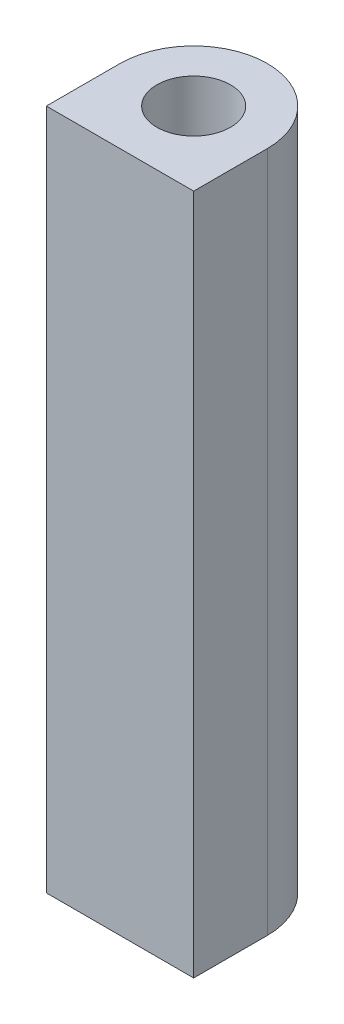
ISO-10303-21;
HEADER;
FILE_DESCRIPTION(('STEP AP214'),'2;1');
FILE_NAME('part.step','',(''),(''),'','','');
FILE_SCHEMA(('AUTOMOTIVE_DESIGN { 1 0 10303 214 1 1 1 1 }'));
ENDSEC;
DATA;
#1=APPLICATION_CONTEXT('core data for automotive mechanical design processes');
#2=APPLICATION_PROTOCOL_DEFINITION('international standard','automotive_design',2000,#1);
#3=PRODUCT_CONTEXT('',#1,'mechanical');
#4=PRODUCT('Part','Part','',(#3));
#5=PRODUCT_RELATED_PRODUCT_CATEGORY('part','',(#4));
#6=PRODUCT_DEFINITION_FORMATION('','',#4);
#7=PRODUCT_DEFINITION_CONTEXT('part definition',#1,'design');
#8=PRODUCT_DEFINITION('design','',#6,#7);
#9=PRODUCT_DEFINITION_SHAPE('','',#8);
#10=(LENGTH_UNIT() NAMED_UNIT(*) SI_UNIT(.MILLI.,.METRE.));
#11=(NAMED_UNIT(*) PLANE_ANGLE_UNIT() SI_UNIT($,.RADIAN.));
#12=(NAMED_UNIT(*) SI_UNIT($,.STERADIAN.) SOLID_ANGLE_UNIT());
#13=UNCERTAINTY_MEASURE_WITH_UNIT(LENGTH_MEASURE(1.E-05),#10,'distance_accuracy_value','');
#14=(GEOMETRIC_REPRESENTATION_CONTEXT(3) GLOBAL_UNCERTAINTY_ASSIGNED_CONTEXT((#13)) GLOBAL_UNIT_ASSIGNED_CONTEXT((#10,
#11,#12)) REPRESENTATION_CONTEXT('',''));
#15=CARTESIAN_POINT('',(0.,0.,0.));
#16=DIRECTION('',(0.,0.,1.));
#17=DIRECTION('',(1.,0.,0.));
#18=AXIS2_PLACEMENT_3D('',#15,#16,#17);
#19=CARTESIAN_POINT('',(0.,46.25,0.));
#20=DIRECTION('',(0.,-1.,0.));
#21=DIRECTION('',(0.,0.,-1.));
#22=AXIS2_PLACEMENT_3D('',#19,#20,#21);
#23=CYLINDRICAL_SURFACE('',#22,2.5);
#24=CARTESIAN_POINT('',(0.,46.25,0.));
#25=DIRECTION('',(0.,-1.,0.));
#26=DIRECTION('',(0.,0.,-1.));
#27=AXIS2_PLACEMENT_3D('',#24,#25,#26);
#28=CIRCLE('',#27,2.5);
#29=CARTESIAN_POINT('',(0.,46.25,-2.5));
#30=VERTEX_POINT('',#29);
#31=EDGE_CURVE('E100',#30,#30,#28,.T.);
#32=ORIENTED_EDGE('',*,*,#31,.F.);
#33=EDGE_LOOP('',(#32));
#34=FACE_BOUND('',#33,.T.);
#35=CARTESIAN_POINT('',(0.,0.,0.));
#36=DIRECTION('',(0.,-1.,0.));
#37=DIRECTION('',(0.,0.,-1.));
#38=AXIS2_PLACEMENT_3D('',#35,#36,#37);
#39=CIRCLE('',#38,2.5);
#40=CARTESIAN_POINT('',(0.,0.,-2.5));
#41=VERTEX_POINT('',#40);
#42=EDGE_CURVE('E20',#41,#41,#39,.T.);
#43=ORIENTED_EDGE('',*,*,#42,.T.);
#44=EDGE_LOOP('',(#43));
#45=FACE_BOUND('',#44,.T.);
#46=ADVANCED_FACE('F17',(#34,#45),#23,.F.);
#47=CARTESIAN_POINT('',(0.,46.25,0.));
#48=DIRECTION('',(0.,-1.,0.));
#49=DIRECTION('',(0.,0.,-1.));
#50=AXIS2_PLACEMENT_3D('',#47,#48,#49);
#51=CYLINDRICAL_SURFACE('',#50,5.);
#52=CARTESIAN_POINT('',(0.,0.,0.));
#53=DIRECTION('',(0.,-1.,0.));
#54=DIRECTION('',(0.,0.,-1.));
#55=AXIS2_PLACEMENT_3D('',#52,#53,#54);
#56=CIRCLE('',#55,5.);
#57=CARTESIAN_POINT('',(5.,0.,0.));
#58=VERTEX_POINT('',#57);
#59=CARTESIAN_POINT('',(-5.,0.,0.));
#60=VERTEX_POINT('',#59);
#61=EDGE_CURVE('E57',#58,#60,#56,.F.);
#62=ORIENTED_EDGE('',*,*,#61,.T.);
#63=DIRECTION('',(0.,1.,0.));
#64=VECTOR('',#63,1.);
#65=CARTESIAN_POINT('',(-5.,0.,0.));
#66=LINE('',#65,#64);
#67=CARTESIAN_POINT('',(-5.,46.25,0.));
#68=VERTEX_POINT('',#67);
#69=EDGE_CURVE('E52',#60,#68,#66,.T.);
#70=ORIENTED_EDGE('',*,*,#69,.T.);
#71=CARTESIAN_POINT('',(0.,46.25,0.));
#72=DIRECTION('',(0.,-1.,0.));
#73=DIRECTION('',(0.,0.,-1.));
#74=AXIS2_PLACEMENT_3D('',#71,#72,#73);
#75=CIRCLE('',#74,5.);
#76=CARTESIAN_POINT('',(5.,46.25,0.));
#77=VERTEX_POINT('',#76);
#78=EDGE_CURVE('E70',#77,#68,#75,.F.);
#79=ORIENTED_EDGE('',*,*,#78,.F.);
#80=DIRECTION('',(0.,1.,0.));
#81=VECTOR('',#80,1.);
#82=CARTESIAN_POINT('',(5.,0.,0.));
#83=LINE('',#82,#81);
#84=EDGE_CURVE('E68',#77,#58,#83,.F.);
#85=ORIENTED_EDGE('',*,*,#84,.T.);
#86=EDGE_LOOP('',(#62,#70,#79,#85));
#87=FACE_BOUND('',#86,.T.);
#88=ADVANCED_FACE('F69',(#87),#51,.T.);
#89=CARTESIAN_POINT('',(5.,0.,0.));
#90=DIRECTION('',(-1.,0.,0.));
#91=DIRECTION('',(0.,0.,1.));
#92=AXIS2_PLACEMENT_3D('',#89,#90,#91);
#93=PLANE('',#92);
#94=DIRECTION('',(0.,1.,0.));
#95=VECTOR('',#94,1.);
#96=CARTESIAN_POINT('',(5.,0.,5.));
#97=LINE('',#96,#95);
#98=CARTESIAN_POINT('',(5.,46.25,5.));
#99=VERTEX_POINT('',#98);
#100=CARTESIAN_POINT('',(5.,0.,5.));
#101=VERTEX_POINT('',#100);
#102=EDGE_CURVE('E78',#99,#101,#97,.F.);
#103=ORIENTED_EDGE('',*,*,#102,.T.);
#104=DIRECTION('',(0.,0.,1.));
#105=VECTOR('',#104,1.);
#106=CARTESIAN_POINT('',(5.,0.,0.));
#107=LINE('',#106,#105);
#108=EDGE_CURVE('E63',#101,#58,#107,.F.);
#109=ORIENTED_EDGE('',*,*,#108,.T.);
#110=ORIENTED_EDGE('',*,*,#84,.F.);
#111=DIRECTION('',(0.,0.,1.));
#112=VECTOR('',#111,1.);
#113=CARTESIAN_POINT('',(5.,46.25,0.));
#114=LINE('',#113,#112);
#115=EDGE_CURVE('E89',#99,#77,#114,.F.);
#116=ORIENTED_EDGE('',*,*,#115,.F.);
#117=EDGE_LOOP('',(#103,#109,#110,#116));
#118=FACE_BOUND('',#117,.T.);
#119=ADVANCED_FACE('F76',(#118),#93,.F.);
#120=CARTESIAN_POINT('',(0.,0.,0.));
#121=DIRECTION('',(0.,1.,0.));
#122=DIRECTION('',(0.,0.,1.));
#123=AXIS2_PLACEMENT_3D('',#120,#121,#122);
#124=PLANE('',#123);
#125=ORIENTED_EDGE('',*,*,#61,.F.);
#126=ORIENTED_EDGE('',*,*,#108,.F.);
#127=DIRECTION('',(-1.,0.,0.));
#128=VECTOR('',#127,1.);
#129=CARTESIAN_POINT('',(0.,0.,5.));
#130=LINE('',#129,#128);
#131=CARTESIAN_POINT('',(-5.,0.,5.));
#132=VERTEX_POINT('',#131);
#133=EDGE_CURVE('E88',#101,#132,#130,.T.);
#134=ORIENTED_EDGE('',*,*,#133,.T.);
#135=DIRECTION('',(0.,0.,-1.));
#136=VECTOR('',#135,1.);
#137=CARTESIAN_POINT('',(-5.,0.,0.));
#138=LINE('',#137,#136);
#139=EDGE_CURVE('E65',#132,#60,#138,.T.);
#140=ORIENTED_EDGE('',*,*,#139,.T.);
#141=EDGE_LOOP('',(#125,#126,#134,#140));
#142=FACE_BOUND('',#141,.T.);
#143=ORIENTED_EDGE('',*,*,#42,.F.);
#144=EDGE_LOOP('',(#143));
#145=FACE_BOUND('',#144,.T.);
#146=ADVANCED_FACE('F59',(#142,#145),#124,.F.);
#147=CARTESIAN_POINT('',(-5.,0.,0.));
#148=DIRECTION('',(1.,0.,0.));
#149=DIRECTION('',(0.,0.,-1.));
#150=AXIS2_PLACEMENT_3D('',#147,#148,#149);
#151=PLANE('',#150);
#152=DIRECTION('',(0.,1.,0.));
#153=VECTOR('',#152,1.);
#154=CARTESIAN_POINT('',(-5.,0.,5.));
#155=LINE('',#154,#153);
#156=CARTESIAN_POINT('',(-5.,46.25,5.));
#157=VERTEX_POINT('',#156);
#158=EDGE_CURVE('E26',#132,#157,#155,.T.);
#159=ORIENTED_EDGE('',*,*,#158,.T.);
#160=DIRECTION('',(0.,0.,1.));
#161=VECTOR('',#160,1.);
#162=CARTESIAN_POINT('',(-5.,46.25,0.));
#163=LINE('',#162,#161);
#164=EDGE_CURVE('E34',#68,#157,#163,.T.);
#165=ORIENTED_EDGE('',*,*,#164,.F.);
#166=ORIENTED_EDGE('',*,*,#69,.F.);
#167=ORIENTED_EDGE('',*,*,#139,.F.);
#168=EDGE_LOOP('',(#159,#165,#166,#167));
#169=FACE_BOUND('',#168,.T.);
#170=ADVANCED_FACE('F116',(#169),#151,.F.);
#171=CARTESIAN_POINT('',(0.,46.25,0.));
#172=DIRECTION('',(0.,1.,0.));
#173=DIRECTION('',(0.,0.,1.));
#174=AXIS2_PLACEMENT_3D('',#171,#172,#173);
#175=PLANE('',#174);
#176=DIRECTION('',(-1.,0.,0.));
#177=VECTOR('',#176,1.);
#178=CARTESIAN_POINT('',(0.,46.25,5.));
#179=LINE('',#178,#177);
#180=EDGE_CURVE('E11',#157,#99,#179,.F.);
#181=ORIENTED_EDGE('',*,*,#180,.T.);
#182=ORIENTED_EDGE('',*,*,#115,.T.);
#183=ORIENTED_EDGE('',*,*,#78,.T.);
#184=ORIENTED_EDGE('',*,*,#164,.T.);
#185=EDGE_LOOP('',(#181,#182,#183,#184));
#186=FACE_BOUND('',#185,.T.);
#187=ORIENTED_EDGE('',*,*,#31,.T.);
#188=EDGE_LOOP('',(#187));
#189=FACE_BOUND('',#188,.T.);
#190=ADVANCED_FACE('F110',(#186,#189),#175,.T.);
#191=CARTESIAN_POINT('',(0.,0.,5.));
#192=DIRECTION('',(0.,0.,-1.));
#193=DIRECTION('',(-1.,0.,0.));
#194=AXIS2_PLACEMENT_3D('',#191,#192,#193);
#195=PLANE('',#194);
#196=ORIENTED_EDGE('',*,*,#158,.F.);
#197=ORIENTED_EDGE('',*,*,#133,.F.);
#198=ORIENTED_EDGE('',*,*,#102,.F.);
#199=ORIENTED_EDGE('',*,*,#180,.F.);
#200=EDGE_LOOP('',(#196,#197,#198,#199));
#201=FACE_BOUND('',#200,.T.);
#202=ADVANCED_FACE('F125',(#201),#195,.F.);
#203=CLOSED_SHELL('',(#46,#88,#119,#146,#170,#190,#202));
#204=MANIFOLD_SOLID_BREP('B1',#203);
#205=ADVANCED_BREP_SHAPE_REPRESENTATION('',(#18,#204),#14);
#206=SHAPE_DEFINITION_REPRESENTATION(#9,#205);
ENDSEC;
END-ISO-10303-21;
